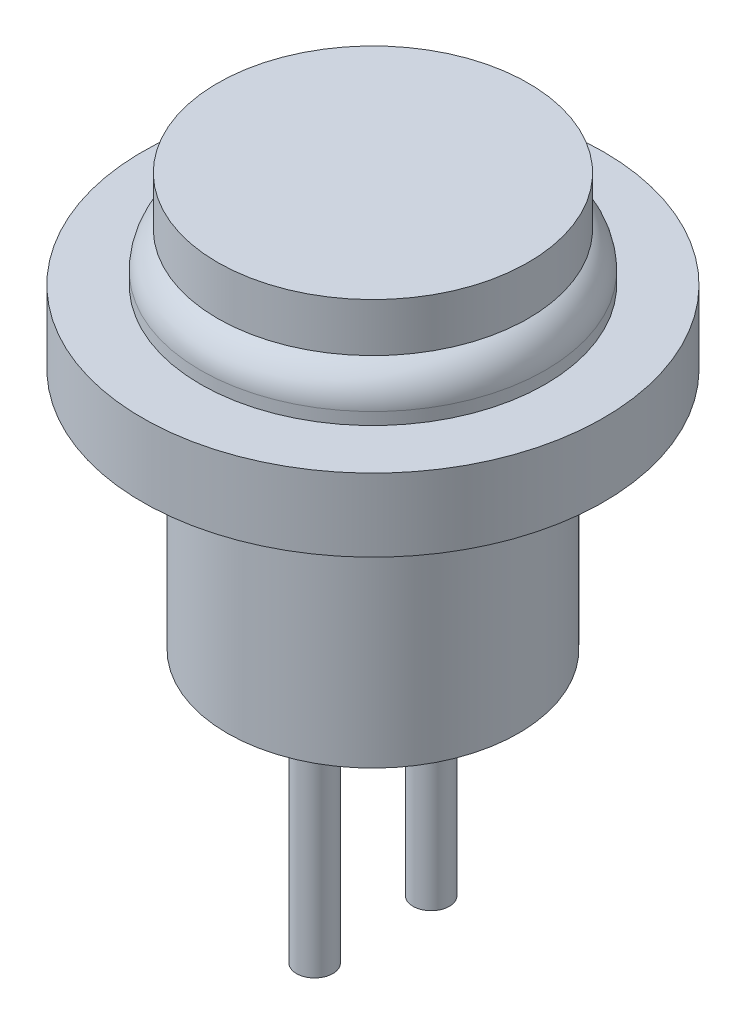
ISO-10303-21;
HEADER;
FILE_DESCRIPTION(('STEP AP214'),'2;1');
FILE_NAME('part.step','',(''),(''),'','','');
FILE_SCHEMA(('AUTOMOTIVE_DESIGN { 1 0 10303 214 1 1 1 1 }'));
ENDSEC;
DATA;
#1=APPLICATION_CONTEXT('core data for automotive mechanical design processes');
#2=APPLICATION_PROTOCOL_DEFINITION('international standard','automotive_design',2000,#1);
#3=PRODUCT_CONTEXT('',#1,'mechanical');
#4=PRODUCT('Part','Part','',(#3));
#5=PRODUCT_RELATED_PRODUCT_CATEGORY('part','',(#4));
#6=PRODUCT_DEFINITION_FORMATION('','',#4);
#7=PRODUCT_DEFINITION_CONTEXT('part definition',#1,'design');
#8=PRODUCT_DEFINITION('design','',#6,#7);
#9=PRODUCT_DEFINITION_SHAPE('','',#8);
#10=(LENGTH_UNIT() NAMED_UNIT(*) SI_UNIT(.MILLI.,.METRE.));
#11=(NAMED_UNIT(*) PLANE_ANGLE_UNIT() SI_UNIT($,.RADIAN.));
#12=(NAMED_UNIT(*) SI_UNIT($,.STERADIAN.) SOLID_ANGLE_UNIT());
#13=UNCERTAINTY_MEASURE_WITH_UNIT(LENGTH_MEASURE(1.E-05),#10,'distance_accuracy_value','');
#14=(GEOMETRIC_REPRESENTATION_CONTEXT(3) GLOBAL_UNCERTAINTY_ASSIGNED_CONTEXT((#13)) GLOBAL_UNIT_ASSIGNED_CONTEXT((#10,
#11,#12)) REPRESENTATION_CONTEXT('',''));
#15=CARTESIAN_POINT('',(0.,0.,0.));
#16=DIRECTION('',(0.,0.,1.));
#17=DIRECTION('',(1.,0.,0.));
#18=AXIS2_PLACEMENT_3D('',#15,#16,#17);
#19=CARTESIAN_POINT('',(0.,2.,0.));
#20=DIRECTION('',(0.,-1.,0.));
#21=DIRECTION('',(0.,0.,-1.));
#22=AXIS2_PLACEMENT_3D('',#19,#20,#21);
#23=CYLINDRICAL_SURFACE('',#22,7.1);
#24=CARTESIAN_POINT('',(0.,0.5,0.));
#25=DIRECTION('',(0.,1.,0.));
#26=DIRECTION('',(0.,0.,1.));
#27=AXIS2_PLACEMENT_3D('',#24,#25,#26);
#28=CIRCLE('',#27,7.1);
#29=CARTESIAN_POINT('',(0.,0.5,7.1));
#30=VERTEX_POINT('',#29);
#31=EDGE_CURVE('E10',#30,#30,#28,.F.);
#32=ORIENTED_EDGE('',*,*,#31,.T.);
#33=EDGE_LOOP('',(#32));
#34=FACE_BOUND('',#33,.T.);
#35=CARTESIAN_POINT('',(0.,0.,0.));
#36=DIRECTION('',(0.,-1.,0.));
#37=DIRECTION('',(0.,0.,-1.));
#38=AXIS2_PLACEMENT_3D('',#35,#36,#37);
#39=CIRCLE('',#38,7.1);
#40=CARTESIAN_POINT('',(0.,0.,-7.1));
#41=VERTEX_POINT('',#40);
#42=EDGE_CURVE('E64',#41,#41,#39,.T.);
#43=ORIENTED_EDGE('',*,*,#42,.F.);
#44=EDGE_LOOP('',(#43));
#45=FACE_BOUND('',#44,.T.);
#46=ADVANCED_FACE('F32',(#34,#45),#23,.T.);
#47=CARTESIAN_POINT('',(0.,0.5,0.));
#48=DIRECTION('',(0.,1.,0.));
#49=DIRECTION('',(0.,0.,1.));
#50=AXIS2_PLACEMENT_3D('',#47,#48,#49);
#51=TOROIDAL_SURFACE('',#50,5.6,1.5);
#52=ORIENTED_EDGE('',*,*,#31,.F.);
#53=EDGE_LOOP('',(#52));
#54=FACE_BOUND('',#53,.T.);
#55=CARTESIAN_POINT('',(0.,2.,0.));
#56=DIRECTION('',(0.,1.,0.));
#57=DIRECTION('',(0.,0.,1.));
#58=AXIS2_PLACEMENT_3D('',#55,#56,#57);
#59=CIRCLE('',#58,5.6);
#60=CARTESIAN_POINT('',(0.,2.,5.6));
#61=VERTEX_POINT('',#60);
#62=EDGE_CURVE('E38',#61,#61,#59,.T.);
#63=ORIENTED_EDGE('',*,*,#62,.F.);
#64=EDGE_LOOP('',(#63));
#65=FACE_BOUND('',#64,.T.);
#66=ADVANCED_FACE('F99',(#54,#65),#51,.T.);
#67=CARTESIAN_POINT('',(0.,4.,0.));
#68=DIRECTION('',(0.,-1.,0.));
#69=DIRECTION('',(0.,0.,-1.));
#70=AXIS2_PLACEMENT_3D('',#67,#68,#69);
#71=CYLINDRICAL_SURFACE('',#70,6.4);
#72=CARTESIAN_POINT('',(0.,4.,0.));
#73=DIRECTION('',(0.,1.,0.));
#74=DIRECTION('',(0.,0.,1.));
#75=AXIS2_PLACEMENT_3D('',#72,#73,#74);
#76=CIRCLE('',#75,6.4);
#77=CARTESIAN_POINT('',(0.,4.,6.4));
#78=VERTEX_POINT('',#77);
#79=EDGE_CURVE('E42',#78,#78,#76,.T.);
#80=ORIENTED_EDGE('',*,*,#79,.F.);
#81=EDGE_LOOP('',(#80));
#82=FACE_BOUND('',#81,.T.);
#83=CARTESIAN_POINT('',(0.,2.,0.));
#84=DIRECTION('',(0.,1.,0.));
#85=DIRECTION('',(0.,0.,1.));
#86=AXIS2_PLACEMENT_3D('',#83,#84,#85);
#87=CIRCLE('',#86,6.4);
#88=CARTESIAN_POINT('',(0.,2.,6.4));
#89=VERTEX_POINT('',#88);
#90=EDGE_CURVE('E46',#89,#89,#87,.T.);
#91=ORIENTED_EDGE('',*,*,#90,.T.);
#92=EDGE_LOOP('',(#91));
#93=FACE_BOUND('',#92,.T.);
#94=ADVANCED_FACE('F103',(#82,#93),#71,.T.);
#95=CARTESIAN_POINT('',(0.,4.,0.));
#96=DIRECTION('',(0.,1.,0.));
#97=DIRECTION('',(0.,0.,1.));
#98=AXIS2_PLACEMENT_3D('',#95,#96,#97);
#99=PLANE('',#98);
#100=ORIENTED_EDGE('',*,*,#79,.T.);
#101=EDGE_LOOP('',(#100));
#102=FACE_BOUND('',#101,.T.);
#103=ADVANCED_FACE('F111',(#102),#99,.T.);
#104=CARTESIAN_POINT('',(0.,2.,0.));
#105=DIRECTION('',(0.,1.,0.));
#106=DIRECTION('',(0.,0.,1.));
#107=AXIS2_PLACEMENT_3D('',#104,#105,#106);
#108=PLANE('',#107);
#109=ORIENTED_EDGE('',*,*,#62,.T.);
#110=EDGE_LOOP('',(#109));
#111=FACE_BOUND('',#110,.T.);
#112=ORIENTED_EDGE('',*,*,#90,.F.);
#113=EDGE_LOOP('',(#112));
#114=FACE_BOUND('',#113,.T.);
#115=ADVANCED_FACE('F95',(#111,#114),#108,.F.);
#116=CARTESIAN_POINT('',(0.,0.,0.));
#117=DIRECTION('',(0.,-1.,0.));
#118=DIRECTION('',(0.,0.,-1.));
#119=AXIS2_PLACEMENT_3D('',#116,#117,#118);
#120=PLANE('',#119);
#121=CARTESIAN_POINT('',(0.,0.,0.));
#122=DIRECTION('',(0.,-1.,0.));
#123=DIRECTION('',(0.,0.,-1.));
#124=AXIS2_PLACEMENT_3D('',#121,#122,#123);
#125=CIRCLE('',#124,9.5);
#126=CARTESIAN_POINT('',(0.,0.,-9.5));
#127=VERTEX_POINT('',#126);
#128=EDGE_CURVE('E70',#127,#127,#125,.T.);
#129=ORIENTED_EDGE('',*,*,#128,.F.);
#130=EDGE_LOOP('',(#129));
#131=FACE_BOUND('',#130,.T.);
#132=ORIENTED_EDGE('',*,*,#42,.T.);
#133=EDGE_LOOP('',(#132));
#134=FACE_BOUND('',#133,.T.);
#135=ADVANCED_FACE('F85',(#131,#134),#120,.F.);
#136=CARTESIAN_POINT('',(0.,-3.,0.));
#137=DIRECTION('',(0.,-1.,0.));
#138=DIRECTION('',(0.,0.,-1.));
#139=AXIS2_PLACEMENT_3D('',#136,#137,#138);
#140=PLANE('',#139);
#141=CARTESIAN_POINT('',(0.,-3.,0.));
#142=DIRECTION('',(0.,-1.,0.));
#143=DIRECTION('',(0.,0.,-1.));
#144=AXIS2_PLACEMENT_3D('',#141,#142,#143);
#145=CIRCLE('',#144,9.5);
#146=CARTESIAN_POINT('',(0.,-3.,-9.5));
#147=VERTEX_POINT('',#146);
#148=EDGE_CURVE('E69',#147,#147,#145,.T.);
#149=ORIENTED_EDGE('',*,*,#148,.T.);
#150=EDGE_LOOP('',(#149));
#151=FACE_BOUND('',#150,.T.);
#152=CARTESIAN_POINT('',(0.,-3.,0.));
#153=DIRECTION('',(0.,-1.,0.));
#154=DIRECTION('',(0.,0.,-1.));
#155=AXIS2_PLACEMENT_3D('',#152,#153,#154);
#156=CIRCLE('',#155,6.);
#157=CARTESIAN_POINT('',(0.,-3.,6.));
#158=VERTEX_POINT('',#157);
#159=EDGE_CURVE('E73',#158,#158,#156,.T.);
#160=ORIENTED_EDGE('',*,*,#159,.F.);
#161=EDGE_LOOP('',(#160));
#162=FACE_BOUND('',#161,.T.);
#163=ADVANCED_FACE('F82',(#151,#162),#140,.T.);
#164=CARTESIAN_POINT('',(0.,-3.,0.));
#165=DIRECTION('',(0.,1.,0.));
#166=DIRECTION('',(0.,0.,1.));
#167=AXIS2_PLACEMENT_3D('',#164,#165,#166);
#168=CYLINDRICAL_SURFACE('',#167,9.5);
#169=ORIENTED_EDGE('',*,*,#148,.F.);
#170=EDGE_LOOP('',(#169));
#171=FACE_BOUND('',#170,.T.);
#172=ORIENTED_EDGE('',*,*,#128,.T.);
#173=EDGE_LOOP('',(#172));
#174=FACE_BOUND('',#173,.T.);
#175=ADVANCED_FACE('F84',(#171,#174),#168,.T.);
#176=CARTESIAN_POINT('',(0.,-23.,2.4));
#177=DIRECTION('',(0.,-1.,0.));
#178=DIRECTION('',(0.,0.,-1.));
#179=AXIS2_PLACEMENT_3D('',#176,#177,#178);
#180=PLANE('',#179);
#181=CARTESIAN_POINT('',(0.,-23.,2.4));
#182=DIRECTION('',(0.,-1.,0.));
#183=DIRECTION('',(0.,0.,-1.));
#184=AXIS2_PLACEMENT_3D('',#181,#182,#183);
#185=CIRCLE('',#184,0.75);
#186=CARTESIAN_POINT('',(0.,-23.,1.65));
#187=VERTEX_POINT('',#186);
#188=EDGE_CURVE('E58',#187,#187,#185,.T.);
#189=ORIENTED_EDGE('',*,*,#188,.T.);
#190=EDGE_LOOP('',(#189));
#191=FACE_BOUND('',#190,.T.);
#192=ADVANCED_FACE('F92',(#191),#180,.T.);
#193=CARTESIAN_POINT('',(0.,-23.,-2.4));
#194=DIRECTION('',(0.,-1.,0.));
#195=DIRECTION('',(0.,0.,-1.));
#196=AXIS2_PLACEMENT_3D('',#193,#194,#195);
#197=PLANE('',#196);
#198=CARTESIAN_POINT('',(0.,-23.,-2.4));
#199=DIRECTION('',(0.,-1.,0.));
#200=DIRECTION('',(0.,0.,-1.));
#201=AXIS2_PLACEMENT_3D('',#198,#199,#200);
#202=CIRCLE('',#201,0.75);
#203=CARTESIAN_POINT('',(0.,-23.,-3.15));
#204=VERTEX_POINT('',#203);
#205=EDGE_CURVE('E54',#204,#204,#202,.T.);
#206=ORIENTED_EDGE('',*,*,#205,.T.);
#207=EDGE_LOOP('',(#206));
#208=FACE_BOUND('',#207,.T.);
#209=ADVANCED_FACE('F132',(#208),#197,.T.);
#210=CARTESIAN_POINT('',(0.,-23.,2.4));
#211=DIRECTION('',(0.,1.,0.));
#212=DIRECTION('',(0.,0.,1.));
#213=AXIS2_PLACEMENT_3D('',#210,#211,#212);
#214=CYLINDRICAL_SURFACE('',#213,0.75);
#215=ORIENTED_EDGE('',*,*,#188,.F.);
#216=EDGE_LOOP('',(#215));
#217=FACE_BOUND('',#216,.T.);
#218=CARTESIAN_POINT('',(0.,-13.,2.4));
#219=DIRECTION('',(0.,-1.,0.));
#220=DIRECTION('',(0.,0.,-1.));
#221=AXIS2_PLACEMENT_3D('',#218,#219,#220);
#222=CIRCLE('',#221,0.75);
#223=CARTESIAN_POINT('',(0.,-13.,1.65));
#224=VERTEX_POINT('',#223);
#225=EDGE_CURVE('E61',#224,#224,#222,.T.);
#226=ORIENTED_EDGE('',*,*,#225,.T.);
#227=EDGE_LOOP('',(#226));
#228=FACE_BOUND('',#227,.T.);
#229=ADVANCED_FACE('F130',(#217,#228),#214,.T.);
#230=CARTESIAN_POINT('',(0.,-23.,-2.4));
#231=DIRECTION('',(0.,1.,0.));
#232=DIRECTION('',(0.,0.,1.));
#233=AXIS2_PLACEMENT_3D('',#230,#231,#232);
#234=CYLINDRICAL_SURFACE('',#233,0.75);
#235=ORIENTED_EDGE('',*,*,#205,.F.);
#236=EDGE_LOOP('',(#235));
#237=FACE_BOUND('',#236,.T.);
#238=CARTESIAN_POINT('',(0.,-13.,-2.4));
#239=DIRECTION('',(0.,-1.,0.));
#240=DIRECTION('',(0.,0.,-1.));
#241=AXIS2_PLACEMENT_3D('',#238,#239,#240);
#242=CIRCLE('',#241,0.75);
#243=CARTESIAN_POINT('',(0.,-13.,-3.15));
#244=VERTEX_POINT('',#243);
#245=EDGE_CURVE('E55',#244,#244,#242,.T.);
#246=ORIENTED_EDGE('',*,*,#245,.T.);
#247=EDGE_LOOP('',(#246));
#248=FACE_BOUND('',#247,.T.);
#249=ADVANCED_FACE('F126',(#237,#248),#234,.T.);
#250=CARTESIAN_POINT('',(0.,-13.,0.));
#251=DIRECTION('',(0.,-1.,0.));
#252=DIRECTION('',(0.,0.,-1.));
#253=AXIS2_PLACEMENT_3D('',#250,#251,#252);
#254=PLANE('',#253);
#255=ORIENTED_EDGE('',*,*,#245,.F.);
#256=EDGE_LOOP('',(#255));
#257=FACE_BOUND('',#256,.T.);
#258=CARTESIAN_POINT('',(0.,-13.,0.));
#259=DIRECTION('',(0.,-1.,0.));
#260=DIRECTION('',(0.,0.,-1.));
#261=AXIS2_PLACEMENT_3D('',#258,#259,#260);
#262=CIRCLE('',#261,6.);
#263=CARTESIAN_POINT('',(0.,-13.,6.));
#264=VERTEX_POINT('',#263);
#265=EDGE_CURVE('E50',#264,#264,#262,.T.);
#266=ORIENTED_EDGE('',*,*,#265,.T.);
#267=EDGE_LOOP('',(#266));
#268=FACE_BOUND('',#267,.T.);
#269=ORIENTED_EDGE('',*,*,#225,.F.);
#270=EDGE_LOOP('',(#269));
#271=FACE_BOUND('',#270,.T.);
#272=ADVANCED_FACE('F123',(#257,#268,#271),#254,.T.);
#273=CARTESIAN_POINT('',(0.,-13.,0.));
#274=DIRECTION('',(0.,1.,0.));
#275=DIRECTION('',(0.,0.,1.));
#276=AXIS2_PLACEMENT_3D('',#273,#274,#275);
#277=CYLINDRICAL_SURFACE('',#276,6.);
#278=CARTESIAN_POINT('',(0.,-3.,6.));
#279=CARTESIAN_POINT('',(0.,-3.10416666666667,6.));
#280=CARTESIAN_POINT('',(0.,-3.20833333333333,6.));
#281=CARTESIAN_POINT('',(0.,-3.41666666666667,6.));
#282=CARTESIAN_POINT('',(0.,-3.52083333333333,6.));
#283=CARTESIAN_POINT('',(0.,-3.72916666666667,6.));
#284=CARTESIAN_POINT('',(0.,-3.83333333333333,6.));
#285=CARTESIAN_POINT('',(0.,-4.04166666666667,6.));
#286=CARTESIAN_POINT('',(0.,-4.14583333333333,6.));
#287=CARTESIAN_POINT('',(0.,-4.35416666666667,6.));
#288=CARTESIAN_POINT('',(0.,-4.45833333333333,6.));
#289=CARTESIAN_POINT('',(0.,-4.66666666666667,6.));
#290=CARTESIAN_POINT('',(0.,-4.77083333333333,6.));
#291=CARTESIAN_POINT('',(0.,-4.97916666666667,6.));
#292=CARTESIAN_POINT('',(0.,-5.08333333333333,6.));
#293=CARTESIAN_POINT('',(0.,-5.29166666666667,6.));
#294=CARTESIAN_POINT('',(0.,-5.39583333333333,6.));
#295=CARTESIAN_POINT('',(0.,-5.60416666666667,6.));
#296=CARTESIAN_POINT('',(0.,-5.70833333333333,6.));
#297=CARTESIAN_POINT('',(0.,-5.91666666666666,6.));
#298=CARTESIAN_POINT('',(0.,-6.02083333333333,6.));
#299=CARTESIAN_POINT('',(0.,-6.22916666666667,6.));
#300=CARTESIAN_POINT('',(0.,-6.33333333333333,6.));
#301=CARTESIAN_POINT('',(0.,-6.54166666666666,6.));
#302=CARTESIAN_POINT('',(0.,-6.64583333333333,6.));
#303=CARTESIAN_POINT('',(0.,-6.85416666666666,6.));
#304=CARTESIAN_POINT('',(0.,-6.95833333333333,6.));
#305=CARTESIAN_POINT('',(0.,-7.16666666666667,6.));
#306=CARTESIAN_POINT('',(0.,-7.27083333333333,6.));
#307=CARTESIAN_POINT('',(0.,-7.47916666666667,6.));
#308=CARTESIAN_POINT('',(0.,-7.58333333333333,6.));
#309=CARTESIAN_POINT('',(0.,-7.79166666666666,6.));
#310=CARTESIAN_POINT('',(0.,-7.89583333333333,6.));
#311=CARTESIAN_POINT('',(0.,-8.10416666666667,6.));
#312=CARTESIAN_POINT('',(0.,-8.20833333333333,6.));
#313=CARTESIAN_POINT('',(0.,-8.41666666666666,6.));
#314=CARTESIAN_POINT('',(0.,-8.52083333333333,6.));
#315=CARTESIAN_POINT('',(0.,-8.72916666666666,6.));
#316=CARTESIAN_POINT('',(0.,-8.83333333333333,6.));
#317=CARTESIAN_POINT('',(0.,-9.04166666666666,6.));
#318=CARTESIAN_POINT('',(0.,-9.14583333333333,6.));
#319=CARTESIAN_POINT('',(0.,-9.35416666666666,6.));
#320=CARTESIAN_POINT('',(0.,-9.45833333333333,6.));
#321=CARTESIAN_POINT('',(0.,-9.66666666666667,6.));
#322=CARTESIAN_POINT('',(0.,-9.77083333333333,6.));
#323=CARTESIAN_POINT('',(0.,-9.97916666666667,6.));
#324=CARTESIAN_POINT('',(0.,-10.0833333333333,6.));
#325=CARTESIAN_POINT('',(0.,-10.2916666666667,6.));
#326=CARTESIAN_POINT('',(0.,-10.3958333333333,6.));
#327=CARTESIAN_POINT('',(0.,-10.6041666666667,6.));
#328=CARTESIAN_POINT('',(0.,-10.7083333333333,6.));
#329=CARTESIAN_POINT('',(0.,-10.9166666666667,6.));
#330=CARTESIAN_POINT('',(0.,-11.0208333333333,6.));
#331=CARTESIAN_POINT('',(0.,-11.2291666666667,6.));
#332=CARTESIAN_POINT('',(0.,-11.3333333333333,6.));
#333=CARTESIAN_POINT('',(0.,-11.5416666666667,6.));
#334=CARTESIAN_POINT('',(0.,-11.6458333333333,6.));
#335=CARTESIAN_POINT('',(0.,-11.8541666666667,6.));
#336=CARTESIAN_POINT('',(0.,-11.9583333333333,6.));
#337=CARTESIAN_POINT('',(0.,-12.1666666666667,6.));
#338=CARTESIAN_POINT('',(0.,-12.2708333333333,6.));
#339=CARTESIAN_POINT('',(0.,-12.4791666666667,6.));
#340=CARTESIAN_POINT('',(0.,-12.5833333333333,6.));
#341=CARTESIAN_POINT('',(0.,-12.7916666666667,6.));
#342=CARTESIAN_POINT('',(0.,-12.8958333333333,6.));
#343=CARTESIAN_POINT('',(0.,-13.,6.));
#344=B_SPLINE_CURVE_WITH_KNOTS('',3,(#278,#279,#280,#281,#282,#283,#284,#285,#286,#287,#288,
#289,#290,#291,#292,#293,#294,#295,#296,#297,#298,#299,#300,#301,#302,#303,#304,#305,#306,#307,
#308,#309,#310,#311,#312,#313,#314,#315,#316,#317,#318,#319,#320,#321,#322,#323,#324,#325,#326,
#327,#328,#329,#330,#331,#332,#333,#334,#335,#336,#337,#338,#339,#340,#341,#342,#343),
.UNSPECIFIED.,.F.,.F.,(4,2,2,2,2,2,2,2,2,2,2,2,2,2,2,2,2,2,2,2,2,2,2,2,2,2,2,2,2,2,2,2,4),(0.,
0.3125,0.625000000000001,0.937500000000001,1.25,1.5625,1.875,2.1875,2.5,2.8125,3.125,3.4375,
3.75,4.0625,4.375,4.6875,5.,5.3125,5.625,5.9375,6.25,6.5625,6.875,7.1875,7.5,7.8125,8.125,
8.4375,8.75,9.0625,9.375,9.6875,10.),.UNSPECIFIED.);
#345=EDGE_CURVE('BSEAM79',#158,#264,#344,.T.);
#346=ORIENTED_EDGE('',*,*,#159,.T.);
#347=ORIENTED_EDGE('',*,*,#265,.F.);
#348=ORIENTED_EDGE('',*,*,#345,.T.);
#349=ORIENTED_EDGE('',*,*,#345,.F.);
#350=EDGE_LOOP('',(#346,#348,#347,#349));
#351=FACE_BOUND('',#350,.T.);
#352=ADVANCED_FACE('F79',(#351),#277,.T.);
#353=CLOSED_SHELL('',(#46,#66,#94,#103,#115,#135,#163,#175,#192,#209,#229,#249,#272,#352));
#354=MANIFOLD_SOLID_BREP('B2',#353);
#355=ADVANCED_BREP_SHAPE_REPRESENTATION('',(#18,#354),#14);
#356=SHAPE_DEFINITION_REPRESENTATION(#9,#355);
ENDSEC;
END-ISO-10303-21;
